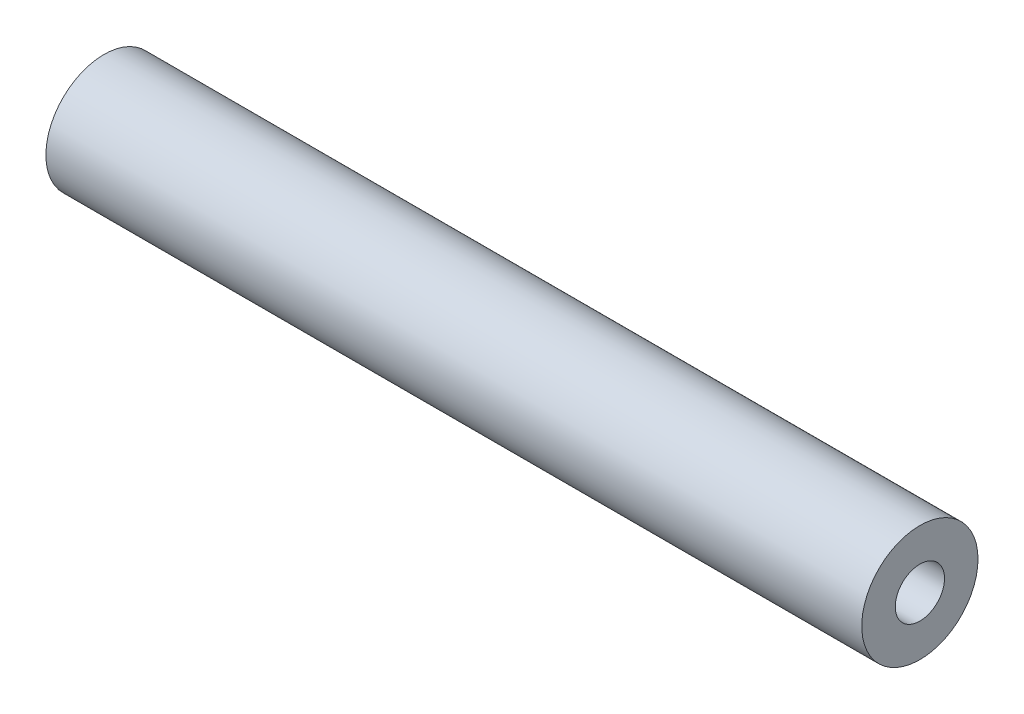
ISO-10303-21;
HEADER;
FILE_DESCRIPTION(('STEP AP214'),'2;1');
FILE_NAME('part.step','',(''),(''),'','','');
FILE_SCHEMA(('AUTOMOTIVE_DESIGN { 1 0 10303 214 1 1 1 1 }'));
ENDSEC;
DATA;
#1=APPLICATION_CONTEXT('core data for automotive mechanical design processes');
#2=APPLICATION_PROTOCOL_DEFINITION('international standard','automotive_design',2000,#1);
#3=PRODUCT_CONTEXT('',#1,'mechanical');
#4=PRODUCT('Part','Part','',(#3));
#5=PRODUCT_RELATED_PRODUCT_CATEGORY('part','',(#4));
#6=PRODUCT_DEFINITION_FORMATION('','',#4);
#7=PRODUCT_DEFINITION_CONTEXT('part definition',#1,'design');
#8=PRODUCT_DEFINITION('design','',#6,#7);
#9=PRODUCT_DEFINITION_SHAPE('','',#8);
#10=(LENGTH_UNIT() NAMED_UNIT(*) SI_UNIT(.MILLI.,.METRE.));
#11=(NAMED_UNIT(*) PLANE_ANGLE_UNIT() SI_UNIT($,.RADIAN.));
#12=(NAMED_UNIT(*) SI_UNIT($,.STERADIAN.) SOLID_ANGLE_UNIT());
#13=UNCERTAINTY_MEASURE_WITH_UNIT(LENGTH_MEASURE(1.E-05),#10,'distance_accuracy_value','');
#14=(GEOMETRIC_REPRESENTATION_CONTEXT(3) GLOBAL_UNCERTAINTY_ASSIGNED_CONTEXT((#13)) GLOBAL_UNIT_ASSIGNED_CONTEXT((#10,
#11,#12)) REPRESENTATION_CONTEXT('',''));
#15=CARTESIAN_POINT('',(0.,0.,0.));
#16=DIRECTION('',(0.,0.,1.));
#17=DIRECTION('',(1.,0.,0.));
#18=AXIS2_PLACEMENT_3D('',#15,#16,#17);
#19=CARTESIAN_POINT('',(66.853999896,0.,0.));
#20=DIRECTION('',(1.,0.,0.));
#21=DIRECTION('',(0.,0.,-1.));
#22=AXIS2_PLACEMENT_3D('',#19,#20,#21);
#23=PLANE('',#22);
#24=CARTESIAN_POINT('',(66.853999896,0.,0.));
#25=DIRECTION('',(1.,0.,0.));
#26=DIRECTION('',(0.,0.,-1.));
#27=AXIS2_PLACEMENT_3D('',#24,#25,#26);
#28=CIRCLE('',#27,4.7625);
#29=CARTESIAN_POINT('',(66.853999896,0.,-4.7625));
#30=VERTEX_POINT('',#29);
#31=EDGE_CURVE('E10',#30,#30,#28,.T.);
#32=ORIENTED_EDGE('',*,*,#31,.T.);
#33=EDGE_LOOP('',(#32));
#34=FACE_BOUND('',#33,.T.);
#35=CARTESIAN_POINT('',(66.853999896,0.,0.));
#36=DIRECTION('',(1.,0.,0.));
#37=DIRECTION('',(0.,0.,-1.));
#38=AXIS2_PLACEMENT_3D('',#35,#36,#37);
#39=CIRCLE('',#38,2.0193);
#40=CARTESIAN_POINT('',(66.853999896,0.,-2.0193));
#41=VERTEX_POINT('',#40);
#42=EDGE_CURVE('E42',#41,#41,#39,.T.);
#43=ORIENTED_EDGE('',*,*,#42,.F.);
#44=EDGE_LOOP('',(#43));
#45=FACE_BOUND('',#44,.T.);
#46=ADVANCED_FACE('F31',(#34,#45),#23,.T.);
#47=CARTESIAN_POINT('',(0.,0.,0.));
#48=DIRECTION('',(1.,0.,0.));
#49=DIRECTION('',(0.,0.,-1.));
#50=AXIS2_PLACEMENT_3D('',#47,#48,#49);
#51=PLANE('',#50);
#52=CARTESIAN_POINT('',(0.,0.,0.));
#53=DIRECTION('',(1.,0.,0.));
#54=DIRECTION('',(0.,0.,-1.));
#55=AXIS2_PLACEMENT_3D('',#52,#53,#54);
#56=CIRCLE('',#55,4.7625);
#57=CARTESIAN_POINT('',(0.,0.,-4.7625));
#58=VERTEX_POINT('',#57);
#59=EDGE_CURVE('E35',#58,#58,#56,.T.);
#60=ORIENTED_EDGE('',*,*,#59,.F.);
#61=EDGE_LOOP('',(#60));
#62=FACE_BOUND('',#61,.T.);
#63=CARTESIAN_POINT('',(0.,0.,0.));
#64=DIRECTION('',(1.,0.,0.));
#65=DIRECTION('',(0.,0.,-1.));
#66=AXIS2_PLACEMENT_3D('',#63,#64,#65);
#67=CIRCLE('',#66,2.0193);
#68=CARTESIAN_POINT('',(0.,0.,-2.0193));
#69=VERTEX_POINT('',#68);
#70=EDGE_CURVE('E44',#69,#69,#67,.T.);
#71=ORIENTED_EDGE('',*,*,#70,.T.);
#72=EDGE_LOOP('',(#71));
#73=FACE_BOUND('',#72,.T.);
#74=ADVANCED_FACE('F54',(#62,#73),#51,.F.);
#75=CARTESIAN_POINT('',(66.853999896,0.,0.));
#76=DIRECTION('',(-1.,0.,0.));
#77=DIRECTION('',(0.,0.,1.));
#78=AXIS2_PLACEMENT_3D('',#75,#76,#77);
#79=CYLINDRICAL_SURFACE('',#78,4.7625);
#80=ORIENTED_EDGE('',*,*,#31,.F.);
#81=EDGE_LOOP('',(#80));
#82=FACE_BOUND('',#81,.T.);
#83=ORIENTED_EDGE('',*,*,#59,.T.);
#84=EDGE_LOOP('',(#83));
#85=FACE_BOUND('',#84,.T.);
#86=ADVANCED_FACE('F33',(#82,#85),#79,.T.);
#87=CARTESIAN_POINT('',(66.853999896,0.,0.));
#88=DIRECTION('',(-1.,0.,0.));
#89=DIRECTION('',(0.,0.,1.));
#90=AXIS2_PLACEMENT_3D('',#87,#88,#89);
#91=CYLINDRICAL_SURFACE('',#90,2.0193);
#92=ORIENTED_EDGE('',*,*,#42,.T.);
#93=EDGE_LOOP('',(#92));
#94=FACE_BOUND('',#93,.T.);
#95=ORIENTED_EDGE('',*,*,#70,.F.);
#96=EDGE_LOOP('',(#95));
#97=FACE_BOUND('',#96,.T.);
#98=ADVANCED_FACE('F50',(#94,#97),#91,.F.);
#99=CLOSED_SHELL('',(#46,#74,#86,#98));
#100=MANIFOLD_SOLID_BREP('B2',#99);
#101=ADVANCED_BREP_SHAPE_REPRESENTATION('',(#18,#100),#14);
#102=SHAPE_DEFINITION_REPRESENTATION(#9,#101);
ENDSEC;
END-ISO-10303-21;
